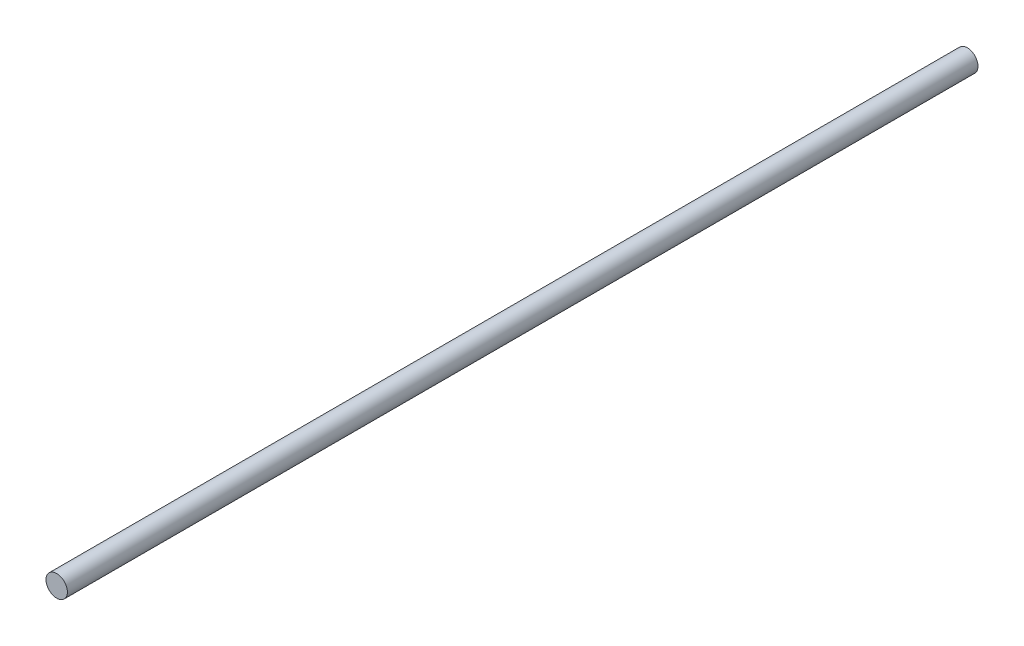
ISO-10303-21;
HEADER;
FILE_DESCRIPTION(('STEP AP214'),'2;1');
FILE_NAME('part.step','',(''),(''),'','','');
FILE_SCHEMA(('AUTOMOTIVE_DESIGN { 1 0 10303 214 1 1 1 1 }'));
ENDSEC;
DATA;
#1=APPLICATION_CONTEXT('core data for automotive mechanical design processes');
#2=APPLICATION_PROTOCOL_DEFINITION('international standard','automotive_design',2000,#1);
#3=PRODUCT_CONTEXT('',#1,'mechanical');
#4=PRODUCT('Part','Part','',(#3));
#5=PRODUCT_RELATED_PRODUCT_CATEGORY('part','',(#4));
#6=PRODUCT_DEFINITION_FORMATION('','',#4);
#7=PRODUCT_DEFINITION_CONTEXT('part definition',#1,'design');
#8=PRODUCT_DEFINITION('design','',#6,#7);
#9=PRODUCT_DEFINITION_SHAPE('','',#8);
#10=(LENGTH_UNIT() NAMED_UNIT(*) SI_UNIT(.MILLI.,.METRE.));
#11=(NAMED_UNIT(*) PLANE_ANGLE_UNIT() SI_UNIT($,.RADIAN.));
#12=(NAMED_UNIT(*) SI_UNIT($,.STERADIAN.) SOLID_ANGLE_UNIT());
#13=UNCERTAINTY_MEASURE_WITH_UNIT(LENGTH_MEASURE(1.E-05),#10,'distance_accuracy_value','');
#14=(GEOMETRIC_REPRESENTATION_CONTEXT(3) GLOBAL_UNCERTAINTY_ASSIGNED_CONTEXT((#13)) GLOBAL_UNIT_ASSIGNED_CONTEXT((#10,
#11,#12)) REPRESENTATION_CONTEXT('',''));
#15=CARTESIAN_POINT('',(0.,0.,0.));
#16=DIRECTION('',(0.,0.,1.));
#17=DIRECTION('',(1.,0.,0.));
#18=AXIS2_PLACEMENT_3D('',#15,#16,#17);
#19=CARTESIAN_POINT('',(0.,0.,270.));
#20=DIRECTION('',(0.,0.,-1.));
#21=DIRECTION('',(-1.,0.,0.));
#22=AXIS2_PLACEMENT_3D('',#19,#20,#21);
#23=CYLINDRICAL_SURFACE('',#22,3.175);
#24=CARTESIAN_POINT('',(0.,0.,270.));
#25=DIRECTION('',(0.,0.,1.));
#26=DIRECTION('',(1.,0.,0.));
#27=AXIS2_PLACEMENT_3D('',#24,#25,#26);
#28=CIRCLE('',#27,3.175);
#29=CARTESIAN_POINT('',(3.175,0.,270.));
#30=VERTEX_POINT('',#29);
#31=EDGE_CURVE('E10',#30,#30,#28,.T.);
#32=ORIENTED_EDGE('',*,*,#31,.F.);
#33=EDGE_LOOP('',(#32));
#34=FACE_BOUND('',#33,.T.);
#35=CARTESIAN_POINT('',(0.,0.,0.));
#36=DIRECTION('',(0.,0.,1.));
#37=DIRECTION('',(1.,0.,0.));
#38=AXIS2_PLACEMENT_3D('',#35,#36,#37);
#39=CIRCLE('',#38,3.175);
#40=CARTESIAN_POINT('',(3.175,0.,0.));
#41=VERTEX_POINT('',#40);
#42=EDGE_CURVE('E38',#41,#41,#39,.T.);
#43=ORIENTED_EDGE('',*,*,#42,.T.);
#44=EDGE_LOOP('',(#43));
#45=FACE_BOUND('',#44,.T.);
#46=ADVANCED_FACE('F35',(#34,#45),#23,.T.);
#47=CARTESIAN_POINT('',(0.,0.,270.));
#48=DIRECTION('',(0.,0.,1.));
#49=DIRECTION('',(1.,0.,0.));
#50=AXIS2_PLACEMENT_3D('',#47,#48,#49);
#51=PLANE('',#50);
#52=ORIENTED_EDGE('',*,*,#31,.T.);
#53=EDGE_LOOP('',(#52));
#54=FACE_BOUND('',#53,.T.);
#55=ADVANCED_FACE('F50',(#54),#51,.T.);
#56=CARTESIAN_POINT('',(0.,0.,0.));
#57=DIRECTION('',(0.,0.,1.));
#58=DIRECTION('',(1.,0.,0.));
#59=AXIS2_PLACEMENT_3D('',#56,#57,#58);
#60=PLANE('',#59);
#61=ORIENTED_EDGE('',*,*,#42,.F.);
#62=EDGE_LOOP('',(#61));
#63=FACE_BOUND('',#62,.T.);
#64=ADVANCED_FACE('F48',(#63),#60,.F.);
#65=CLOSED_SHELL('',(#46,#55,#64));
#66=MANIFOLD_SOLID_BREP('B2',#65);
#67=ADVANCED_BREP_SHAPE_REPRESENTATION('',(#18,#66),#14);
#68=SHAPE_DEFINITION_REPRESENTATION(#9,#67);
ENDSEC;
END-ISO-10303-21;
